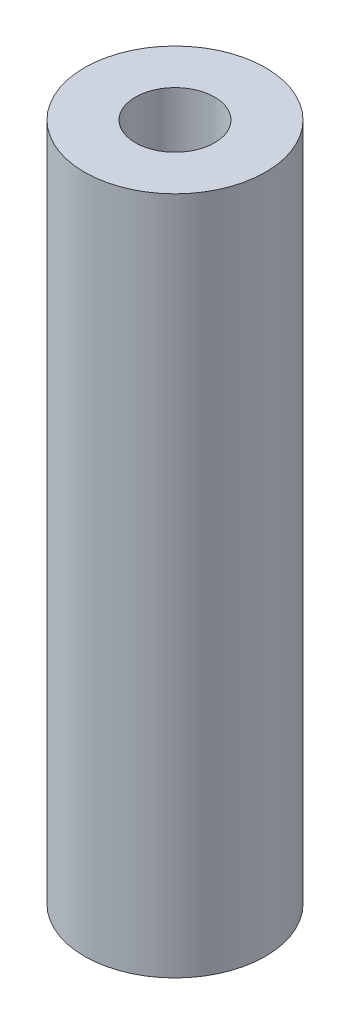
ISO-10303-21;
HEADER;
FILE_DESCRIPTION(('STEP AP214'),'2;1');
FILE_NAME('part.step','',(''),(''),'','','');
FILE_SCHEMA(('AUTOMOTIVE_DESIGN { 1 0 10303 214 1 1 1 1 }'));
ENDSEC;
DATA;
#1=APPLICATION_CONTEXT('core data for automotive mechanical design processes');
#2=APPLICATION_PROTOCOL_DEFINITION('international standard','automotive_design',2000,#1);
#3=PRODUCT_CONTEXT('',#1,'mechanical');
#4=PRODUCT('Part','Part','',(#3));
#5=PRODUCT_RELATED_PRODUCT_CATEGORY('part','',(#4));
#6=PRODUCT_DEFINITION_FORMATION('','',#4);
#7=PRODUCT_DEFINITION_CONTEXT('part definition',#1,'design');
#8=PRODUCT_DEFINITION('design','',#6,#7);
#9=PRODUCT_DEFINITION_SHAPE('','',#8);
#10=(LENGTH_UNIT() NAMED_UNIT(*) SI_UNIT(.MILLI.,.METRE.));
#11=(NAMED_UNIT(*) PLANE_ANGLE_UNIT() SI_UNIT($,.RADIAN.));
#12=(NAMED_UNIT(*) SI_UNIT($,.STERADIAN.) SOLID_ANGLE_UNIT());
#13=UNCERTAINTY_MEASURE_WITH_UNIT(LENGTH_MEASURE(1.E-05),#10,'distance_accuracy_value','');
#14=(GEOMETRIC_REPRESENTATION_CONTEXT(3) GLOBAL_UNCERTAINTY_ASSIGNED_CONTEXT((#13)) GLOBAL_UNIT_ASSIGNED_CONTEXT((#10,
#11,#12)) REPRESENTATION_CONTEXT('',''));
#15=CARTESIAN_POINT('',(0.,0.,0.));
#16=DIRECTION('',(0.,0.,1.));
#17=DIRECTION('',(1.,0.,0.));
#18=AXIS2_PLACEMENT_3D('',#15,#16,#17);
#19=CARTESIAN_POINT('',(-0.795143336687018,30.,-0.384950345538953));
#20=DIRECTION('',(0.,1.,0.));
#21=DIRECTION('',(0.,0.,1.));
#22=AXIS2_PLACEMENT_3D('',#19,#20,#21);
#23=PLANE('',#22);
#24=CARTESIAN_POINT('',(-0.795143336687018,30.,-0.384950345538953));
#25=DIRECTION('',(0.,1.,0.));
#26=DIRECTION('',(0.,0.,1.));
#27=AXIS2_PLACEMENT_3D('',#24,#25,#26);
#28=CIRCLE('',#27,4.);
#29=CARTESIAN_POINT('',(-0.795143336687018,30.,3.61504965446105));
#30=VERTEX_POINT('',#29);
#31=EDGE_CURVE('E10',#30,#30,#28,.T.);
#32=ORIENTED_EDGE('',*,*,#31,.T.);
#33=EDGE_LOOP('',(#32));
#34=FACE_BOUND('',#33,.T.);
#35=CARTESIAN_POINT('',(-0.795143336687018,30.,-0.384950345538953));
#36=DIRECTION('',(0.,1.,0.));
#37=DIRECTION('',(0.,0.,1.));
#38=AXIS2_PLACEMENT_3D('',#35,#36,#37);
#39=CIRCLE('',#38,1.75);
#40=CARTESIAN_POINT('',(-0.795143336687018,30.,1.36504965446105));
#41=VERTEX_POINT('',#40);
#42=EDGE_CURVE('E50',#41,#41,#39,.T.);
#43=ORIENTED_EDGE('',*,*,#42,.F.);
#44=EDGE_LOOP('',(#43));
#45=FACE_BOUND('',#44,.T.);
#46=ADVANCED_FACE('F37',(#34,#45),#23,.T.);
#47=CARTESIAN_POINT('',(-0.795143336687018,0.,-0.384950345538953));
#48=DIRECTION('',(0.,1.,0.));
#49=DIRECTION('',(0.,0.,1.));
#50=AXIS2_PLACEMENT_3D('',#47,#48,#49);
#51=PLANE('',#50);
#52=CARTESIAN_POINT('',(-0.795143336687018,0.,-0.384950345538953));
#53=DIRECTION('',(0.,1.,0.));
#54=DIRECTION('',(0.,0.,1.));
#55=AXIS2_PLACEMENT_3D('',#52,#53,#54);
#56=CIRCLE('',#55,4.);
#57=CARTESIAN_POINT('',(-0.795143336687018,0.,3.61504965446105));
#58=VERTEX_POINT('',#57);
#59=EDGE_CURVE('E41',#58,#58,#56,.T.);
#60=ORIENTED_EDGE('',*,*,#59,.F.);
#61=EDGE_LOOP('',(#60));
#62=FACE_BOUND('',#61,.T.);
#63=CARTESIAN_POINT('',(-0.795143336687018,0.,-0.384950345538953));
#64=DIRECTION('',(0.,1.,0.));
#65=DIRECTION('',(0.,0.,1.));
#66=AXIS2_PLACEMENT_3D('',#63,#64,#65);
#67=CIRCLE('',#66,1.75);
#68=CARTESIAN_POINT('',(-0.795143336687018,0.,1.36504965446105));
#69=VERTEX_POINT('',#68);
#70=EDGE_CURVE('E52',#69,#69,#67,.T.);
#71=ORIENTED_EDGE('',*,*,#70,.T.);
#72=EDGE_LOOP('',(#71));
#73=FACE_BOUND('',#72,.T.);
#74=ADVANCED_FACE('F64',(#62,#73),#51,.F.);
#75=CARTESIAN_POINT('',(-0.795143336687018,30.,-0.384950345538953));
#76=DIRECTION('',(0.,-1.,0.));
#77=DIRECTION('',(0.,0.,-1.));
#78=AXIS2_PLACEMENT_3D('',#75,#76,#77);
#79=CYLINDRICAL_SURFACE('',#78,4.);
#80=ORIENTED_EDGE('',*,*,#31,.F.);
#81=EDGE_LOOP('',(#80));
#82=FACE_BOUND('',#81,.T.);
#83=ORIENTED_EDGE('',*,*,#59,.T.);
#84=EDGE_LOOP('',(#83));
#85=FACE_BOUND('',#84,.T.);
#86=ADVANCED_FACE('F39',(#82,#85),#79,.T.);
#87=CARTESIAN_POINT('',(-0.795143336687018,30.,-0.384950345538953));
#88=DIRECTION('',(0.,-1.,0.));
#89=DIRECTION('',(0.,0.,-1.));
#90=AXIS2_PLACEMENT_3D('',#87,#88,#89);
#91=CYLINDRICAL_SURFACE('',#90,1.75);
#92=ORIENTED_EDGE('',*,*,#42,.T.);
#93=EDGE_LOOP('',(#92));
#94=FACE_BOUND('',#93,.T.);
#95=ORIENTED_EDGE('',*,*,#70,.F.);
#96=EDGE_LOOP('',(#95));
#97=FACE_BOUND('',#96,.T.);
#98=ADVANCED_FACE('F60',(#94,#97),#91,.F.);
#99=CLOSED_SHELL('',(#46,#74,#86,#98));
#100=MANIFOLD_SOLID_BREP('B2',#99);
#101=ADVANCED_BREP_SHAPE_REPRESENTATION('',(#18,#100),#14);
#102=SHAPE_DEFINITION_REPRESENTATION(#9,#101);
ENDSEC;
END-ISO-10303-21;
